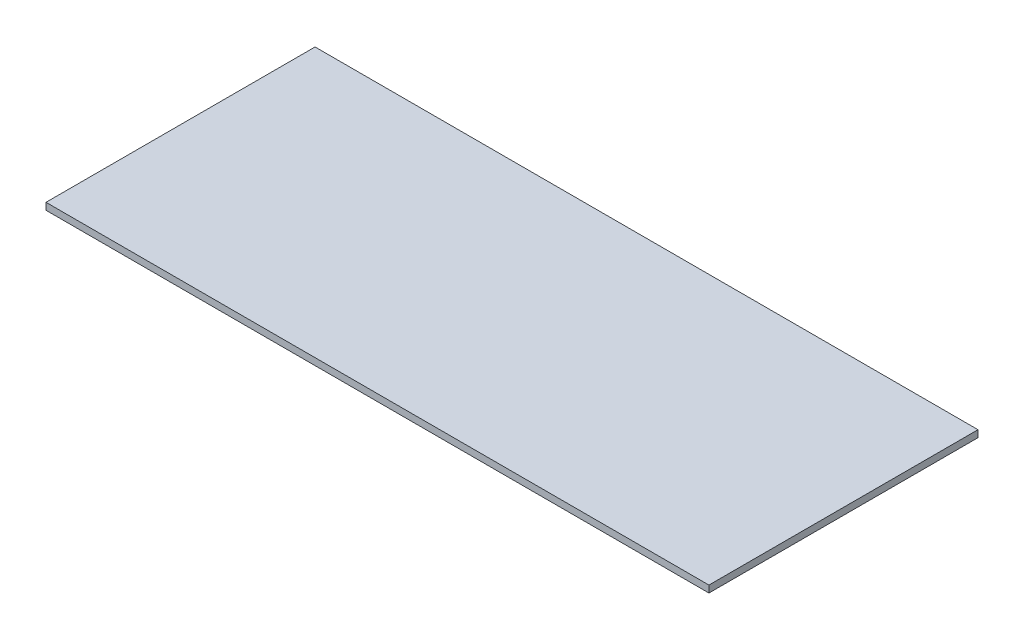
ISO-10303-21;
HEADER;
FILE_DESCRIPTION(('STEP AP214'),'2;1');
FILE_NAME('part.step','',(''),(''),'','','');
FILE_SCHEMA(('AUTOMOTIVE_DESIGN { 1 0 10303 214 1 1 1 1 }'));
ENDSEC;
DATA;
#1=APPLICATION_CONTEXT('core data for automotive mechanical design processes');
#2=APPLICATION_PROTOCOL_DEFINITION('international standard','automotive_design',2000,#1);
#3=PRODUCT_CONTEXT('',#1,'mechanical');
#4=PRODUCT('Part','Part','',(#3));
#5=PRODUCT_RELATED_PRODUCT_CATEGORY('part','',(#4));
#6=PRODUCT_DEFINITION_FORMATION('','',#4);
#7=PRODUCT_DEFINITION_CONTEXT('part definition',#1,'design');
#8=PRODUCT_DEFINITION('design','',#6,#7);
#9=PRODUCT_DEFINITION_SHAPE('','',#8);
#10=(LENGTH_UNIT() NAMED_UNIT(*) SI_UNIT(.MILLI.,.METRE.));
#11=(NAMED_UNIT(*) PLANE_ANGLE_UNIT() SI_UNIT($,.RADIAN.));
#12=(NAMED_UNIT(*) SI_UNIT($,.STERADIAN.) SOLID_ANGLE_UNIT());
#13=UNCERTAINTY_MEASURE_WITH_UNIT(LENGTH_MEASURE(1.E-05),#10,'distance_accuracy_value','');
#14=(GEOMETRIC_REPRESENTATION_CONTEXT(3) GLOBAL_UNCERTAINTY_ASSIGNED_CONTEXT((#13)) GLOBAL_UNIT_ASSIGNED_CONTEXT((#10,
#11,#12)) REPRESENTATION_CONTEXT('',''));
#15=CARTESIAN_POINT('',(0.,0.,0.));
#16=DIRECTION('',(0.,0.,1.));
#17=DIRECTION('',(1.,0.,0.));
#18=AXIS2_PLACEMENT_3D('',#15,#16,#17);
#19=CARTESIAN_POINT('',(-59.1289481870499,4.7625,-156.391847579448));
#20=DIRECTION('',(1.,0.,0.));
#21=DIRECTION('',(0.,0.,-1.));
#22=AXIS2_PLACEMENT_3D('',#19,#20,#21);
#23=PLANE('',#22);
#24=DIRECTION('',(0.,0.,1.));
#25=VECTOR('',#24,1.);
#26=CARTESIAN_POINT('',(-59.1289481870499,0.,-156.391847579448));
#27=LINE('',#26,#25);
#28=CARTESIAN_POINT('',(-59.1289481870499,0.,-156.391847579448));
#29=VERTEX_POINT('',#28);
#30=CARTESIAN_POINT('',(-59.1289481870498,0.,28.4005184205515));
#31=VERTEX_POINT('',#30);
#32=EDGE_CURVE('E98',#29,#31,#27,.T.);
#33=ORIENTED_EDGE('',*,*,#32,.T.);
#34=DIRECTION('',(0.,-1.,0.));
#35=VECTOR('',#34,1.);
#36=CARTESIAN_POINT('',(-59.1289481870498,4.7625,28.4005184205515));
#37=LINE('',#36,#35);
#38=CARTESIAN_POINT('',(-59.1289481870498,4.7625,28.4005184205515));
#39=VERTEX_POINT('',#38);
#40=EDGE_CURVE('E11',#39,#31,#37,.T.);
#41=ORIENTED_EDGE('',*,*,#40,.F.);
#42=DIRECTION('',(0.,0.,1.));
#43=VECTOR('',#42,1.);
#44=CARTESIAN_POINT('',(-59.1289481870499,4.7625,-156.391847579448));
#45=LINE('',#44,#43);
#46=CARTESIAN_POINT('',(-59.1289481870499,4.7625,-156.391847579448));
#47=VERTEX_POINT('',#46);
#48=EDGE_CURVE('E86',#47,#39,#45,.T.);
#49=ORIENTED_EDGE('',*,*,#48,.F.);
#50=DIRECTION('',(0.,-1.,0.));
#51=VECTOR('',#50,1.);
#52=CARTESIAN_POINT('',(-59.1289481870499,4.7625,-156.391847579448));
#53=LINE('',#52,#51);
#54=EDGE_CURVE('E94',#47,#29,#53,.T.);
#55=ORIENTED_EDGE('',*,*,#54,.T.);
#56=EDGE_LOOP('',(#33,#41,#49,#55));
#57=FACE_BOUND('',#56,.T.);
#58=ADVANCED_FACE('F35',(#57),#23,.F.);
#59=CARTESIAN_POINT('',(-59.1289481870498,4.7625,28.4005184205515));
#60=DIRECTION('',(0.,0.,-1.));
#61=DIRECTION('',(-1.,0.,0.));
#62=AXIS2_PLACEMENT_3D('',#59,#60,#61);
#63=PLANE('',#62);
#64=DIRECTION('',(1.,0.,0.));
#65=VECTOR('',#64,1.);
#66=CARTESIAN_POINT('',(-59.1289481870498,0.,28.4005184205515));
#67=LINE('',#66,#65);
#68=CARTESIAN_POINT('',(396.17105181295,0.,28.4005184205515));
#69=VERTEX_POINT('',#68);
#70=EDGE_CURVE('E90',#31,#69,#67,.T.);
#71=ORIENTED_EDGE('',*,*,#70,.T.);
#72=DIRECTION('',(0.,-1.,0.));
#73=VECTOR('',#72,1.);
#74=CARTESIAN_POINT('',(396.17105181295,4.7625,28.4005184205515));
#75=LINE('',#74,#73);
#76=CARTESIAN_POINT('',(396.17105181295,4.7625,28.4005184205515));
#77=VERTEX_POINT('',#76);
#78=EDGE_CURVE('E43',#77,#69,#75,.T.);
#79=ORIENTED_EDGE('',*,*,#78,.F.);
#80=DIRECTION('',(1.,0.,0.));
#81=VECTOR('',#80,1.);
#82=CARTESIAN_POINT('',(-59.1289481870498,4.7625,28.4005184205515));
#83=LINE('',#82,#81);
#84=EDGE_CURVE('E81',#39,#77,#83,.T.);
#85=ORIENTED_EDGE('',*,*,#84,.F.);
#86=ORIENTED_EDGE('',*,*,#40,.T.);
#87=EDGE_LOOP('',(#71,#79,#85,#86));
#88=FACE_BOUND('',#87,.T.);
#89=ADVANCED_FACE('F89',(#88),#63,.F.);
#90=CARTESIAN_POINT('',(396.17105181295,4.7625,-156.391847579448));
#91=DIRECTION('',(-1.,0.,0.));
#92=DIRECTION('',(0.,0.,1.));
#93=AXIS2_PLACEMENT_3D('',#90,#91,#92);
#94=PLANE('',#93);
#95=DIRECTION('',(0.,0.,-1.));
#96=VECTOR('',#95,1.);
#97=CARTESIAN_POINT('',(396.17105181295,0.,-156.391847579448));
#98=LINE('',#97,#96);
#99=CARTESIAN_POINT('',(396.17105181295,0.,-156.391847579448));
#100=VERTEX_POINT('',#99);
#101=EDGE_CURVE('E68',#69,#100,#98,.T.);
#102=ORIENTED_EDGE('',*,*,#101,.T.);
#103=DIRECTION('',(0.,-1.,0.));
#104=VECTOR('',#103,1.);
#105=CARTESIAN_POINT('',(396.17105181295,4.7625,-156.391847579448));
#106=LINE('',#105,#104);
#107=CARTESIAN_POINT('',(396.17105181295,4.7625,-156.391847579448));
#108=VERTEX_POINT('',#107);
#109=EDGE_CURVE('E91',#108,#100,#106,.T.);
#110=ORIENTED_EDGE('',*,*,#109,.F.);
#111=DIRECTION('',(0.,0.,-1.));
#112=VECTOR('',#111,1.);
#113=CARTESIAN_POINT('',(396.17105181295,4.7625,-156.391847579448));
#114=LINE('',#113,#112);
#115=EDGE_CURVE('E84',#77,#108,#114,.T.);
#116=ORIENTED_EDGE('',*,*,#115,.F.);
#117=ORIENTED_EDGE('',*,*,#78,.T.);
#118=EDGE_LOOP('',(#102,#110,#116,#117));
#119=FACE_BOUND('',#118,.T.);
#120=ADVANCED_FACE('F92',(#119),#94,.F.);
#121=CARTESIAN_POINT('',(-59.1289481870499,4.7625,-156.391847579448));
#122=DIRECTION('',(0.,0.,1.));
#123=DIRECTION('',(1.,0.,0.));
#124=AXIS2_PLACEMENT_3D('',#121,#122,#123);
#125=PLANE('',#124);
#126=DIRECTION('',(-1.,0.,0.));
#127=VECTOR('',#126,1.);
#128=CARTESIAN_POINT('',(-59.1289481870499,0.,-156.391847579448));
#129=LINE('',#128,#127);
#130=EDGE_CURVE('E74',#100,#29,#129,.T.);
#131=ORIENTED_EDGE('',*,*,#130,.T.);
#132=ORIENTED_EDGE('',*,*,#54,.F.);
#133=DIRECTION('',(-1.,0.,0.));
#134=VECTOR('',#133,1.);
#135=CARTESIAN_POINT('',(-59.1289481870499,4.7625,-156.391847579448));
#136=LINE('',#135,#134);
#137=EDGE_CURVE('E51',#108,#47,#136,.T.);
#138=ORIENTED_EDGE('',*,*,#137,.F.);
#139=ORIENTED_EDGE('',*,*,#109,.T.);
#140=EDGE_LOOP('',(#131,#132,#138,#139));
#141=FACE_BOUND('',#140,.T.);
#142=ADVANCED_FACE('F105',(#141),#125,.F.);
#143=CARTESIAN_POINT('',(0.,4.7625,0.));
#144=DIRECTION('',(0.,1.,0.));
#145=DIRECTION('',(0.,0.,1.));
#146=AXIS2_PLACEMENT_3D('',#143,#144,#145);
#147=PLANE('',#146);
#148=ORIENTED_EDGE('',*,*,#48,.T.);
#149=ORIENTED_EDGE('',*,*,#84,.T.);
#150=ORIENTED_EDGE('',*,*,#115,.T.);
#151=ORIENTED_EDGE('',*,*,#137,.T.);
#152=EDGE_LOOP('',(#148,#149,#150,#151));
#153=FACE_BOUND('',#152,.T.);
#154=ADVANCED_FACE('F82',(#153),#147,.T.);
#155=CARTESIAN_POINT('',(0.,0.,0.));
#156=DIRECTION('',(0.,1.,0.));
#157=DIRECTION('',(0.,0.,1.));
#158=AXIS2_PLACEMENT_3D('',#155,#156,#157);
#159=PLANE('',#158);
#160=ORIENTED_EDGE('',*,*,#32,.F.);
#161=ORIENTED_EDGE('',*,*,#130,.F.);
#162=ORIENTED_EDGE('',*,*,#101,.F.);
#163=ORIENTED_EDGE('',*,*,#70,.F.);
#164=EDGE_LOOP('',(#160,#161,#162,#163));
#165=FACE_BOUND('',#164,.T.);
#166=ADVANCED_FACE('F108',(#165),#159,.F.);
#167=CLOSED_SHELL('',(#58,#89,#120,#142,#154,#166));
#168=MANIFOLD_SOLID_BREP('B2',#167);
#169=ADVANCED_BREP_SHAPE_REPRESENTATION('',(#18,#168),#14);
#170=SHAPE_DEFINITION_REPRESENTATION(#9,#169);
ENDSEC;
END-ISO-10303-21;
